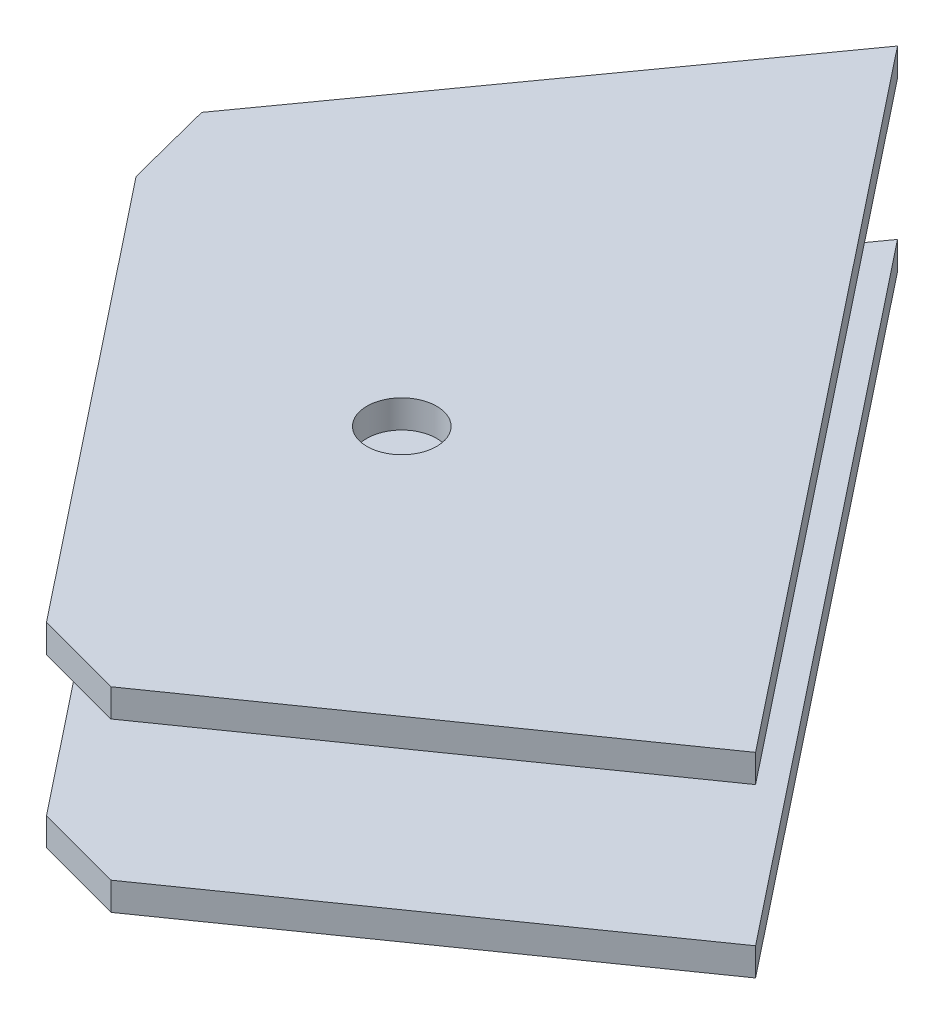
ISO-10303-21;
HEADER;
FILE_DESCRIPTION(('STEP AP214'),'2;1');
FILE_NAME('part.step','',(''),(''),'','','');
FILE_SCHEMA(('AUTOMOTIVE_DESIGN { 1 0 10303 214 1 1 1 1 }'));
ENDSEC;
DATA;
#1=APPLICATION_CONTEXT('core data for automotive mechanical design processes');
#2=APPLICATION_PROTOCOL_DEFINITION('international standard','automotive_design',2000,#1);
#3=PRODUCT_CONTEXT('',#1,'mechanical');
#4=PRODUCT('Part','Part','',(#3));
#5=PRODUCT_RELATED_PRODUCT_CATEGORY('part','',(#4));
#6=PRODUCT_DEFINITION_FORMATION('','',#4);
#7=PRODUCT_DEFINITION_CONTEXT('part definition',#1,'design');
#8=PRODUCT_DEFINITION('design','',#6,#7);
#9=PRODUCT_DEFINITION_SHAPE('','',#8);
#10=(LENGTH_UNIT() NAMED_UNIT(*) SI_UNIT(.MILLI.,.METRE.));
#11=(NAMED_UNIT(*) PLANE_ANGLE_UNIT() SI_UNIT($,.RADIAN.));
#12=(NAMED_UNIT(*) SI_UNIT($,.STERADIAN.) SOLID_ANGLE_UNIT());
#13=UNCERTAINTY_MEASURE_WITH_UNIT(LENGTH_MEASURE(1.E-05),#10,'distance_accuracy_value','');
#14=(GEOMETRIC_REPRESENTATION_CONTEXT(3) GLOBAL_UNCERTAINTY_ASSIGNED_CONTEXT((#13)) GLOBAL_UNIT_ASSIGNED_CONTEXT((#10,
#11,#12)) REPRESENTATION_CONTEXT('',''));
#15=CARTESIAN_POINT('',(0.,0.,0.));
#16=DIRECTION('',(0.,0.,1.));
#17=DIRECTION('',(1.,0.,0.));
#18=AXIS2_PLACEMENT_3D('',#15,#16,#17);
#19=CARTESIAN_POINT('',(7.29288874574905,-8.89,33.75901036086));
#20=DIRECTION('',(-0.258818999626621,0.,0.965925838474303));
#21=DIRECTION('',(0.965925838474303,0.,0.258818999626621));
#22=AXIS2_PLACEMENT_3D('',#19,#20,#21);
#23=PLANE('',#22);
#24=DIRECTION('',(0.965925838474302,0.,0.258818999626621));
#25=VECTOR('',#24,1.);
#26=CARTESIAN_POINT('',(7.29288874574905,-6.35,33.75901036086));
#27=LINE('',#26,#25);
#28=CARTESIAN_POINT('',(-0.713995357916995,-6.35,31.613572635423));
#29=VERTEX_POINT('',#28);
#30=CARTESIAN_POINT('',(7.29288874574905,-6.35,33.75901036086));
#31=VERTEX_POINT('',#30);
#32=EDGE_CURVE('E130',#29,#31,#27,.T.);
#33=ORIENTED_EDGE('',*,*,#32,.F.);
#34=DIRECTION('',(0.,1.,0.));
#35=VECTOR('',#34,1.);
#36=CARTESIAN_POINT('',(-0.713995357916995,-8.89,31.613572635423));
#37=LINE('',#36,#35);
#38=CARTESIAN_POINT('',(-0.713995357916995,-8.89,31.613572635423));
#39=VERTEX_POINT('',#38);
#40=EDGE_CURVE('E12',#39,#29,#37,.T.);
#41=ORIENTED_EDGE('',*,*,#40,.F.);
#42=DIRECTION('',(0.965925838474302,0.,0.258818999626621));
#43=VECTOR('',#42,1.);
#44=CARTESIAN_POINT('',(7.29288874574905,-8.89,33.75901036086));
#45=LINE('',#44,#43);
#46=CARTESIAN_POINT('',(7.29288874574905,-8.89,33.75901036086));
#47=VERTEX_POINT('',#46);
#48=EDGE_CURVE('E145',#39,#47,#45,.T.);
#49=ORIENTED_EDGE('',*,*,#48,.T.);
#50=DIRECTION('',(0.,1.,0.));
#51=VECTOR('',#50,1.);
#52=CARTESIAN_POINT('',(7.29288874574905,-8.89,33.75901036086));
#53=LINE('',#52,#51);
#54=EDGE_CURVE('E94',#47,#31,#53,.T.);
#55=ORIENTED_EDGE('',*,*,#54,.T.);
#56=EDGE_LOOP('',(#33,#41,#49,#55));
#57=FACE_BOUND('',#56,.T.);
#58=ADVANCED_FACE('F44',(#57),#23,.T.);
#59=CARTESIAN_POINT('',(-0.713995357916995,-8.89,31.613572635423));
#60=DIRECTION('',(-0.783884943902112,0.,0.620906107816297));
#61=DIRECTION('',(0.620906107816297,0.,0.783884943902112));
#62=AXIS2_PLACEMENT_3D('',#59,#60,#61);
#63=PLANE('',#62);
#64=DIRECTION('',(0.620906107816297,0.,0.783884943902112));
#65=VECTOR('',#64,1.);
#66=CARTESIAN_POINT('',(-0.713995357916995,-6.35,31.613572635423));
#67=LINE('',#66,#65);
#68=CARTESIAN_POINT('',(-31.777418824543,-6.35,-7.6035483672712));
#69=VERTEX_POINT('',#68);
#70=EDGE_CURVE('E143',#69,#29,#67,.T.);
#71=ORIENTED_EDGE('',*,*,#70,.F.);
#72=DIRECTION('',(0.,1.,0.));
#73=VECTOR('',#72,1.);
#74=CARTESIAN_POINT('',(-31.777418824543,-8.89,-7.6035483672712));
#75=LINE('',#74,#73);
#76=CARTESIAN_POINT('',(-31.777418824543,-8.89,-7.6035483672712));
#77=VERTEX_POINT('',#76);
#78=EDGE_CURVE('E53',#77,#69,#75,.T.);
#79=ORIENTED_EDGE('',*,*,#78,.F.);
#80=DIRECTION('',(0.620906107816297,0.,0.783884943902112));
#81=VECTOR('',#80,1.);
#82=CARTESIAN_POINT('',(-0.713995357916995,-8.89,31.613572635423));
#83=LINE('',#82,#81);
#84=EDGE_CURVE('E120',#77,#39,#83,.T.);
#85=ORIENTED_EDGE('',*,*,#84,.T.);
#86=ORIENTED_EDGE('',*,*,#40,.T.);
#87=EDGE_LOOP('',(#71,#79,#85,#86));
#88=FACE_BOUND('',#87,.T.);
#89=ADVANCED_FACE('F179',(#88),#63,.T.);
#90=CARTESIAN_POINT('',(-33.8367792385884,-8.89,-15.6330023193371));
#91=DIRECTION('',(-0.968648595473999,0.,0.248434897883244));
#92=DIRECTION('',(0.248434897883244,0.,0.968648595473999));
#93=AXIS2_PLACEMENT_3D('',#90,#91,#92);
#94=PLANE('',#93);
#95=DIRECTION('',(0.248434897883244,0.,0.968648595473999));
#96=VECTOR('',#95,1.);
#97=CARTESIAN_POINT('',(-33.8367792385884,-6.35,-15.6330023193371));
#98=LINE('',#97,#96);
#99=CARTESIAN_POINT('',(-33.8367792385884,-6.35,-15.6330023193371));
#100=VERTEX_POINT('',#99);
#101=EDGE_CURVE('E107',#100,#69,#98,.T.);
#102=ORIENTED_EDGE('',*,*,#101,.F.);
#103=DIRECTION('',(0.,1.,0.));
#104=VECTOR('',#103,1.);
#105=CARTESIAN_POINT('',(-33.8367792385884,-8.89,-15.6330023193371));
#106=LINE('',#105,#104);
#107=CARTESIAN_POINT('',(-33.8367792385884,-8.89,-15.6330023193371));
#108=VERTEX_POINT('',#107);
#109=EDGE_CURVE('E102',#108,#100,#106,.T.);
#110=ORIENTED_EDGE('',*,*,#109,.F.);
#111=DIRECTION('',(0.248434897883244,0.,0.968648595473999));
#112=VECTOR('',#111,1.);
#113=CARTESIAN_POINT('',(-33.8367792385884,-8.89,-15.6330023193371));
#114=LINE('',#113,#112);
#115=EDGE_CURVE('E105',#108,#77,#114,.T.);
#116=ORIENTED_EDGE('',*,*,#115,.T.);
#117=ORIENTED_EDGE('',*,*,#78,.T.);
#118=EDGE_LOOP('',(#102,#110,#116,#117));
#119=FACE_BOUND('',#118,.T.);
#120=ADVANCED_FACE('F104',(#119),#94,.T.);
#121=CARTESIAN_POINT('',(-7.41224478573321,-8.89,-52.5218809641673));
#122=DIRECTION('',(-0.812947488311234,0.,-0.582336999724785));
#123=DIRECTION('',(-0.582336999724785,0.,0.812947488311234));
#124=AXIS2_PLACEMENT_3D('',#121,#122,#123);
#125=PLANE('',#124);
#126=DIRECTION('',(-0.582336999724785,0.,0.812947488311234));
#127=VECTOR('',#126,1.);
#128=CARTESIAN_POINT('',(-7.41224478573321,-6.35,-52.5218809641673));
#129=LINE('',#128,#127);
#130=CARTESIAN_POINT('',(-7.41224478573321,-6.35,-52.5218809641673));
#131=VERTEX_POINT('',#130);
#132=EDGE_CURVE('E140',#131,#100,#129,.T.);
#133=ORIENTED_EDGE('',*,*,#132,.F.);
#134=DIRECTION('',(0.,1.,0.));
#135=VECTOR('',#134,1.);
#136=CARTESIAN_POINT('',(-7.41224478573321,-8.89,-52.5218809641673));
#137=LINE('',#136,#135);
#138=CARTESIAN_POINT('',(-7.41224478573321,-8.89,-52.5218809641673));
#139=VERTEX_POINT('',#138);
#140=EDGE_CURVE('E112',#139,#131,#137,.T.);
#141=ORIENTED_EDGE('',*,*,#140,.F.);
#142=DIRECTION('',(-0.582336999724785,0.,0.812947488311234));
#143=VECTOR('',#142,1.);
#144=CARTESIAN_POINT('',(-7.41224478573321,-8.89,-52.5218809641673));
#145=LINE('',#144,#143);
#146=EDGE_CURVE('E118',#139,#108,#145,.T.);
#147=ORIENTED_EDGE('',*,*,#146,.T.);
#148=ORIENTED_EDGE('',*,*,#109,.T.);
#149=EDGE_LOOP('',(#133,#141,#147,#148));
#150=FACE_BOUND('',#149,.T.);
#151=ADVANCED_FACE('F122',(#150),#125,.T.);
#152=CARTESIAN_POINT('',(41.7943980712831,-8.89,9.60079103076962));
#153=DIRECTION('',(0.783884943901653,0.,-0.620906107816878));
#154=DIRECTION('',(-0.620906107816878,0.,-0.783884943901653));
#155=AXIS2_PLACEMENT_3D('',#152,#153,#154);
#156=PLANE('',#155);
#157=DIRECTION('',(-0.620906107816877,0.,-0.783884943901653));
#158=VECTOR('',#157,1.);
#159=CARTESIAN_POINT('',(41.7943980712831,-6.35,9.60079103076962));
#160=LINE('',#159,#158);
#161=CARTESIAN_POINT('',(41.7943980712831,-6.35,9.60079103076962));
#162=VERTEX_POINT('',#161);
#163=EDGE_CURVE('E137',#162,#131,#160,.T.);
#164=ORIENTED_EDGE('',*,*,#163,.F.);
#165=DIRECTION('',(0.,1.,0.));
#166=VECTOR('',#165,1.);
#167=CARTESIAN_POINT('',(41.7943980712831,-8.89,9.60079103076962));
#168=LINE('',#167,#166);
#169=CARTESIAN_POINT('',(41.7943980712831,-8.89,9.60079103076962));
#170=VERTEX_POINT('',#169);
#171=EDGE_CURVE('E149',#170,#162,#168,.T.);
#172=ORIENTED_EDGE('',*,*,#171,.F.);
#173=DIRECTION('',(-0.620906107816877,0.,-0.783884943901653));
#174=VECTOR('',#173,1.);
#175=CARTESIAN_POINT('',(41.7943980712831,-8.89,9.60079103076962));
#176=LINE('',#175,#174);
#177=EDGE_CURVE('E123',#170,#139,#176,.T.);
#178=ORIENTED_EDGE('',*,*,#177,.T.);
#179=ORIENTED_EDGE('',*,*,#140,.T.);
#180=EDGE_LOOP('',(#164,#172,#178,#179));
#181=FACE_BOUND('',#180,.T.);
#182=ADVANCED_FACE('F192',(#181),#156,.T.);
#183=CARTESIAN_POINT('',(7.29288874574905,-8.89,33.75901036086));
#184=DIRECTION('',(0.573576474916939,0.,0.819152017284862));
#185=DIRECTION('',(0.819152017284862,0.,-0.573576474916939));
#186=AXIS2_PLACEMENT_3D('',#183,#184,#185);
#187=PLANE('',#186);
#188=DIRECTION('',(0.819152017284862,0.,-0.573576474916939));
#189=VECTOR('',#188,1.);
#190=CARTESIAN_POINT('',(7.29288874574905,-6.35,33.75901036086));
#191=LINE('',#190,#189);
#192=EDGE_CURVE('E133',#31,#162,#191,.T.);
#193=ORIENTED_EDGE('',*,*,#192,.F.);
#194=ORIENTED_EDGE('',*,*,#54,.F.);
#195=DIRECTION('',(0.819152017284862,0.,-0.573576474916939));
#196=VECTOR('',#195,1.);
#197=CARTESIAN_POINT('',(7.29288874574905,-8.89,33.75901036086));
#198=LINE('',#197,#196);
#199=EDGE_CURVE('E125',#47,#170,#198,.T.);
#200=ORIENTED_EDGE('',*,*,#199,.T.);
#201=ORIENTED_EDGE('',*,*,#171,.T.);
#202=EDGE_LOOP('',(#193,#194,#200,#201));
#203=FACE_BOUND('',#202,.T.);
#204=ADVANCED_FACE('F175',(#203),#187,.T.);
#205=CARTESIAN_POINT('',(-56.8970717772462,-8.89,16.5593655155835));
#206=DIRECTION('',(0.,1.,0.));
#207=DIRECTION('',(0.,0.,1.));
#208=AXIS2_PLACEMENT_3D('',#205,#206,#207);
#209=PLANE('',#208);
#210=CARTESIAN_POINT('',(-7.16806872071792,-8.89,-4.67914789860527));
#211=DIRECTION('',(0.,-1.,0.));
#212=DIRECTION('',(0.,0.,-1.));
#213=AXIS2_PLACEMENT_3D('',#210,#211,#212);
#214=CIRCLE('',#213,1.1303);
#215=CARTESIAN_POINT('',(-7.16806872071792,-8.89,-5.80944789860527));
#216=VERTEX_POINT('',#215);
#217=EDGE_CURVE('E168',#216,#216,#214,.T.);
#218=ORIENTED_EDGE('',*,*,#217,.F.);
#219=EDGE_LOOP('',(#218));
#220=FACE_BOUND('',#219,.T.);
#221=CARTESIAN_POINT('',(-9.82664781130841,-8.89,0.0922157824151844));
#222=DIRECTION('',(0.,-1.,0.));
#223=DIRECTION('',(0.,0.,-1.));
#224=AXIS2_PLACEMENT_3D('',#221,#222,#223);
#225=CIRCLE('',#224,1.1303);
#226=CARTESIAN_POINT('',(-9.82664781130841,-8.89,-1.03808421758482));
#227=VERTEX_POINT('',#226);
#228=EDGE_CURVE('E158',#227,#227,#225,.T.);
#229=ORIENTED_EDGE('',*,*,#228,.F.);
#230=EDGE_LOOP('',(#229));
#231=FACE_BOUND('',#230,.T.);
#232=CARTESIAN_POINT('',(-4.35086165779025,-8.89,7.854263646402));
#233=DIRECTION('',(0.,-1.,0.));
#234=DIRECTION('',(0.,0.,-1.));
#235=AXIS2_PLACEMENT_3D('',#232,#233,#234);
#236=CIRCLE('',#235,1.1303);
#237=CARTESIAN_POINT('',(-4.35086165779025,-8.89,6.723963646402));
#238=VERTEX_POINT('',#237);
#239=EDGE_CURVE('E155',#238,#238,#236,.T.);
#240=ORIENTED_EDGE('',*,*,#239,.F.);
#241=EDGE_LOOP('',(#240));
#242=FACE_BOUND('',#241,.T.);
#243=CARTESIAN_POINT('',(0.,-8.89,0.));
#244=DIRECTION('',(0.,1.,0.));
#245=DIRECTION('',(0.,0.,1.));
#246=AXIS2_PLACEMENT_3D('',#243,#244,#245);
#247=CIRCLE('',#246,3.175);
#248=CARTESIAN_POINT('',(0.,-8.89,3.175));
#249=VERTEX_POINT('',#248);
#250=EDGE_CURVE('E134',#249,#249,#247,.T.);
#251=ORIENTED_EDGE('',*,*,#250,.T.);
#252=EDGE_LOOP('',(#251));
#253=FACE_BOUND('',#252,.T.);
#254=ORIENTED_EDGE('',*,*,#48,.F.);
#255=ORIENTED_EDGE('',*,*,#84,.F.);
#256=ORIENTED_EDGE('',*,*,#115,.F.);
#257=ORIENTED_EDGE('',*,*,#146,.F.);
#258=ORIENTED_EDGE('',*,*,#177,.F.);
#259=ORIENTED_EDGE('',*,*,#199,.F.);
#260=EDGE_LOOP('',(#254,#255,#256,#257,#258,#259));
#261=FACE_BOUND('',#260,.T.);
#262=ADVANCED_FACE('F116',(#220,#231,#242,#253,#261),#209,.F.);
#263=CARTESIAN_POINT('',(-56.8970717772462,-6.35,16.5593655155835));
#264=DIRECTION('',(0.,1.,0.));
#265=DIRECTION('',(0.,0.,1.));
#266=AXIS2_PLACEMENT_3D('',#263,#264,#265);
#267=PLANE('',#266);
#268=CARTESIAN_POINT('',(-7.16806872071792,-6.35,-4.67914789860527));
#269=DIRECTION('',(0.,1.,0.));
#270=DIRECTION('',(0.,0.,1.));
#271=AXIS2_PLACEMENT_3D('',#268,#269,#270);
#272=CIRCLE('',#271,1.1303);
#273=CARTESIAN_POINT('',(-7.16806872071792,-6.35,-3.54884789860527));
#274=VERTEX_POINT('',#273);
#275=EDGE_CURVE('E47',#274,#274,#272,.T.);
#276=ORIENTED_EDGE('',*,*,#275,.F.);
#277=EDGE_LOOP('',(#276));
#278=FACE_BOUND('',#277,.T.);
#279=CARTESIAN_POINT('',(-9.82664781130841,-6.35,0.0922157824151844));
#280=DIRECTION('',(0.,1.,0.));
#281=DIRECTION('',(0.,0.,1.));
#282=AXIS2_PLACEMENT_3D('',#279,#280,#281);
#283=CIRCLE('',#282,1.1303);
#284=CARTESIAN_POINT('',(-9.82664781130841,-6.35,1.22251578241519));
#285=VERTEX_POINT('',#284);
#286=EDGE_CURVE('E156',#285,#285,#283,.T.);
#287=ORIENTED_EDGE('',*,*,#286,.F.);
#288=EDGE_LOOP('',(#287));
#289=FACE_BOUND('',#288,.T.);
#290=CARTESIAN_POINT('',(-4.35086165779025,-6.35,7.854263646402));
#291=DIRECTION('',(0.,1.,0.));
#292=DIRECTION('',(0.,0.,1.));
#293=AXIS2_PLACEMENT_3D('',#290,#291,#292);
#294=CIRCLE('',#293,1.1303);
#295=CARTESIAN_POINT('',(-4.35086165779025,-6.35,8.984563646402));
#296=VERTEX_POINT('',#295);
#297=EDGE_CURVE('E152',#296,#296,#294,.T.);
#298=ORIENTED_EDGE('',*,*,#297,.F.);
#299=EDGE_LOOP('',(#298));
#300=FACE_BOUND('',#299,.T.);
#301=CARTESIAN_POINT('',(0.,-6.35,0.));
#302=DIRECTION('',(0.,1.,0.));
#303=DIRECTION('',(0.,0.,1.));
#304=AXIS2_PLACEMENT_3D('',#301,#302,#303);
#305=CIRCLE('',#304,3.175);
#306=CARTESIAN_POINT('',(0.,-6.35,3.175));
#307=VERTEX_POINT('',#306);
#308=EDGE_CURVE('E154',#307,#307,#305,.T.);
#309=ORIENTED_EDGE('',*,*,#308,.F.);
#310=EDGE_LOOP('',(#309));
#311=FACE_BOUND('',#310,.T.);
#312=ORIENTED_EDGE('',*,*,#32,.T.);
#313=ORIENTED_EDGE('',*,*,#192,.T.);
#314=ORIENTED_EDGE('',*,*,#163,.T.);
#315=ORIENTED_EDGE('',*,*,#132,.T.);
#316=ORIENTED_EDGE('',*,*,#101,.T.);
#317=ORIENTED_EDGE('',*,*,#70,.T.);
#318=EDGE_LOOP('',(#312,#313,#314,#315,#316,#317));
#319=FACE_BOUND('',#318,.T.);
#320=ADVANCED_FACE('F178',(#278,#289,#300,#311,#319),#267,.T.);
#321=CARTESIAN_POINT('',(0.,-8.89,0.));
#322=DIRECTION('',(0.,1.,0.));
#323=DIRECTION('',(0.,0.,1.));
#324=AXIS2_PLACEMENT_3D('',#321,#322,#323);
#325=CYLINDRICAL_SURFACE('',#324,3.175);
#326=ORIENTED_EDGE('',*,*,#250,.F.);
#327=EDGE_LOOP('',(#326));
#328=FACE_BOUND('',#327,.T.);
#329=ORIENTED_EDGE('',*,*,#308,.T.);
#330=EDGE_LOOP('',(#329));
#331=FACE_BOUND('',#330,.T.);
#332=ADVANCED_FACE('F203',(#328,#331),#325,.F.);
#333=CARTESIAN_POINT('',(-4.35086165779025,-3.81,7.854263646402));
#334=DIRECTION('',(0.,-1.,0.));
#335=DIRECTION('',(0.,0.,-1.));
#336=AXIS2_PLACEMENT_3D('',#333,#334,#335);
#337=CYLINDRICAL_SURFACE('',#336,1.1303);
#338=ORIENTED_EDGE('',*,*,#297,.T.);
#339=EDGE_LOOP('',(#338));
#340=FACE_BOUND('',#339,.T.);
#341=ORIENTED_EDGE('',*,*,#239,.T.);
#342=EDGE_LOOP('',(#341));
#343=FACE_BOUND('',#342,.T.);
#344=ADVANCED_FACE('F210',(#340,#343),#337,.F.);
#345=CARTESIAN_POINT('',(-9.82664781130841,-3.81,0.0922157824151844));
#346=DIRECTION('',(0.,-1.,0.));
#347=DIRECTION('',(0.,0.,-1.));
#348=AXIS2_PLACEMENT_3D('',#345,#346,#347);
#349=CYLINDRICAL_SURFACE('',#348,1.1303);
#350=ORIENTED_EDGE('',*,*,#286,.T.);
#351=EDGE_LOOP('',(#350));
#352=FACE_BOUND('',#351,.T.);
#353=ORIENTED_EDGE('',*,*,#228,.T.);
#354=EDGE_LOOP('',(#353));
#355=FACE_BOUND('',#354,.T.);
#356=ADVANCED_FACE('F214',(#352,#355),#349,.F.);
#357=CARTESIAN_POINT('',(-7.16806872071792,-3.81,-4.67914789860527));
#358=DIRECTION('',(0.,-1.,0.));
#359=DIRECTION('',(0.,0.,-1.));
#360=AXIS2_PLACEMENT_3D('',#357,#358,#359);
#361=CYLINDRICAL_SURFACE('',#360,1.1303);
#362=ORIENTED_EDGE('',*,*,#275,.T.);
#363=EDGE_LOOP('',(#362));
#364=FACE_BOUND('',#363,.T.);
#365=ORIENTED_EDGE('',*,*,#217,.T.);
#366=EDGE_LOOP('',(#365));
#367=FACE_BOUND('',#366,.T.);
#368=ADVANCED_FACE('F218',(#364,#367),#361,.F.);
#369=CLOSED_SHELL('',(#58,#89,#120,#151,#182,#204,#262,#320,#332,#344,#356,#368));
#370=MANIFOLD_SOLID_BREP('B2',#369);
#371=CARTESIAN_POINT('',(41.7943980712831,8.89,9.60079103076962));
#372=DIRECTION('',(0.,1.,0.));
#373=DIRECTION('',(0.,0.,1.));
#374=AXIS2_PLACEMENT_3D('',#371,#372,#373);
#375=PLANE('',#374);
#376=DIRECTION('',(0.819152017284862,0.,-0.573576474916939));
#377=VECTOR('',#376,1.);
#378=CARTESIAN_POINT('',(7.29288874574905,8.89,33.75901036086));
#379=LINE('',#378,#377);
#380=CARTESIAN_POINT('',(7.29288874574905,8.89,33.75901036086));
#381=VERTEX_POINT('',#380);
#382=CARTESIAN_POINT('',(41.7943980712831,8.89,9.60079103076962));
#383=VERTEX_POINT('',#382);
#384=EDGE_CURVE('E375',#381,#383,#379,.T.);
#385=ORIENTED_EDGE('',*,*,#384,.T.);
#386=DIRECTION('',(-0.620906107816877,0.,-0.783884943901653));
#387=VECTOR('',#386,1.);
#388=CARTESIAN_POINT('',(41.7943980712831,8.89,9.60079103076962));
#389=LINE('',#388,#387);
#390=CARTESIAN_POINT('',(-7.41224478573321,8.89,-52.5218809641673));
#391=VERTEX_POINT('',#390);
#392=EDGE_CURVE('E333',#383,#391,#389,.T.);
#393=ORIENTED_EDGE('',*,*,#392,.T.);
#394=DIRECTION('',(-0.582336999724785,0.,0.812947488311234));
#395=VECTOR('',#394,1.);
#396=CARTESIAN_POINT('',(-7.41224478573321,8.89,-52.5218809641673));
#397=LINE('',#396,#395);
#398=CARTESIAN_POINT('',(-33.8367792385884,8.89,-15.6330023193371));
#399=VERTEX_POINT('',#398);
#400=EDGE_CURVE('E346',#391,#399,#397,.T.);
#401=ORIENTED_EDGE('',*,*,#400,.T.);
#402=DIRECTION('',(0.248434897883244,0.,0.968648595473999));
#403=VECTOR('',#402,1.);
#404=CARTESIAN_POINT('',(-33.8367792385884,8.89,-15.6330023193371));
#405=LINE('',#404,#403);
#406=CARTESIAN_POINT('',(-31.777418824543,8.89,-7.6035483672712));
#407=VERTEX_POINT('',#406);
#408=EDGE_CURVE('E340',#399,#407,#405,.T.);
#409=ORIENTED_EDGE('',*,*,#408,.T.);
#410=DIRECTION('',(0.620906107816297,0.,0.783884943902112));
#411=VECTOR('',#410,1.);
#412=CARTESIAN_POINT('',(-0.713995357916995,8.89,31.613572635423));
#413=LINE('',#412,#411);
#414=CARTESIAN_POINT('',(-0.713995357916995,8.89,31.613572635423));
#415=VERTEX_POINT('',#414);
#416=EDGE_CURVE('E344',#407,#415,#413,.T.);
#417=ORIENTED_EDGE('',*,*,#416,.T.);
#418=DIRECTION('',(0.965925838474302,0.,0.258818999626621));
#419=VECTOR('',#418,1.);
#420=CARTESIAN_POINT('',(7.29288874574905,8.89,33.75901036086));
#421=LINE('',#420,#419);
#422=EDGE_CURVE('E296',#415,#381,#421,.T.);
#423=ORIENTED_EDGE('',*,*,#422,.T.);
#424=EDGE_LOOP('',(#385,#393,#401,#409,#417,#423));
#425=FACE_BOUND('',#424,.T.);
#426=CARTESIAN_POINT('',(0.,8.89,0.));
#427=DIRECTION('',(0.,1.,0.));
#428=DIRECTION('',(0.,0.,1.));
#429=AXIS2_PLACEMENT_3D('',#426,#427,#428);
#430=CIRCLE('',#429,3.175);
#431=CARTESIAN_POINT('',(0.,8.89,3.175));
#432=VERTEX_POINT('',#431);
#433=EDGE_CURVE('E368',#432,#432,#430,.T.);
#434=ORIENTED_EDGE('',*,*,#433,.F.);
#435=EDGE_LOOP('',(#434));
#436=FACE_BOUND('',#435,.T.);
#437=ADVANCED_FACE('F279',(#425,#436),#375,.T.);
#438=CARTESIAN_POINT('',(41.7943980712831,6.35,9.60079103076962));
#439=DIRECTION('',(0.,1.,0.));
#440=DIRECTION('',(0.,0.,1.));
#441=AXIS2_PLACEMENT_3D('',#438,#439,#440);
#442=PLANE('',#441);
#443=DIRECTION('',(0.819152017284862,0.,-0.573576474916939));
#444=VECTOR('',#443,1.);
#445=CARTESIAN_POINT('',(7.29288874574905,6.35,33.75901036086));
#446=LINE('',#445,#444);
#447=CARTESIAN_POINT('',(7.29288874574905,6.35,33.75901036086));
#448=VERTEX_POINT('',#447);
#449=CARTESIAN_POINT('',(41.7943980712831,6.35,9.60079103076962));
#450=VERTEX_POINT('',#449);
#451=EDGE_CURVE('E364',#448,#450,#446,.T.);
#452=ORIENTED_EDGE('',*,*,#451,.F.);
#453=DIRECTION('',(0.965925838474302,0.,0.258818999626621));
#454=VECTOR('',#453,1.);
#455=CARTESIAN_POINT('',(7.29288874574905,6.35,33.75901036086));
#456=LINE('',#455,#454);
#457=CARTESIAN_POINT('',(-0.713995357916995,6.35,31.613572635423));
#458=VERTEX_POINT('',#457);
#459=EDGE_CURVE('E325',#458,#448,#456,.T.);
#460=ORIENTED_EDGE('',*,*,#459,.F.);
#461=DIRECTION('',(0.620906107816297,0.,0.783884943902112));
#462=VECTOR('',#461,1.);
#463=CARTESIAN_POINT('',(-0.713995357916995,6.35,31.613572635423));
#464=LINE('',#463,#462);
#465=CARTESIAN_POINT('',(-31.777418824543,6.35,-7.6035483672712));
#466=VERTEX_POINT('',#465);
#467=EDGE_CURVE('E319',#466,#458,#464,.T.);
#468=ORIENTED_EDGE('',*,*,#467,.F.);
#469=DIRECTION('',(0.248434897883244,0.,0.968648595473999));
#470=VECTOR('',#469,1.);
#471=CARTESIAN_POINT('',(-33.8367792385884,6.35,-15.6330023193371));
#472=LINE('',#471,#470);
#473=CARTESIAN_POINT('',(-33.8367792385884,6.35,-15.6330023193371));
#474=VERTEX_POINT('',#473);
#475=EDGE_CURVE('E354',#474,#466,#472,.T.);
#476=ORIENTED_EDGE('',*,*,#475,.F.);
#477=DIRECTION('',(-0.582336999724785,0.,0.812947488311234));
#478=VECTOR('',#477,1.);
#479=CARTESIAN_POINT('',(-7.41224478573321,6.35,-52.5218809641673));
#480=LINE('',#479,#478);
#481=CARTESIAN_POINT('',(-7.41224478573321,6.35,-52.5218809641673));
#482=VERTEX_POINT('',#481);
#483=EDGE_CURVE('E370',#482,#474,#480,.T.);
#484=ORIENTED_EDGE('',*,*,#483,.F.);
#485=DIRECTION('',(-0.620906107816877,0.,-0.783884943901653));
#486=VECTOR('',#485,1.);
#487=CARTESIAN_POINT('',(41.7943980712831,6.35,9.60079103076962));
#488=LINE('',#487,#486);
#489=EDGE_CURVE('E367',#450,#482,#488,.T.);
#490=ORIENTED_EDGE('',*,*,#489,.F.);
#491=EDGE_LOOP('',(#452,#460,#468,#476,#484,#490));
#492=FACE_BOUND('',#491,.T.);
#493=CARTESIAN_POINT('',(0.,6.35,0.));
#494=DIRECTION('',(0.,1.,0.));
#495=DIRECTION('',(0.,0.,1.));
#496=AXIS2_PLACEMENT_3D('',#493,#494,#495);
#497=CIRCLE('',#496,3.175);
#498=CARTESIAN_POINT('',(0.,6.35,3.175));
#499=VERTEX_POINT('',#498);
#500=EDGE_CURVE('E450',#499,#499,#497,.T.);
#501=ORIENTED_EDGE('',*,*,#500,.T.);
#502=EDGE_LOOP('',(#501));
#503=FACE_BOUND('',#502,.T.);
#504=ADVANCED_FACE('F384',(#492,#503),#442,.F.);
#505=CARTESIAN_POINT('',(7.29288874574905,8.89,33.75901036086));
#506=DIRECTION('',(-0.573576474916939,0.,-0.819152017284862));
#507=DIRECTION('',(-0.819152017284862,0.,0.573576474916939));
#508=AXIS2_PLACEMENT_3D('',#505,#506,#507);
#509=PLANE('',#508);
#510=ORIENTED_EDGE('',*,*,#451,.T.);
#511=DIRECTION('',(0.,-1.,0.));
#512=VECTOR('',#511,1.);
#513=CARTESIAN_POINT('',(41.7943980712831,8.89,9.60079103076962));
#514=LINE('',#513,#512);
#515=EDGE_CURVE('E42',#383,#450,#514,.T.);
#516=ORIENTED_EDGE('',*,*,#515,.F.);
#517=ORIENTED_EDGE('',*,*,#384,.F.);
#518=DIRECTION('',(0.,-1.,0.));
#519=VECTOR('',#518,1.);
#520=CARTESIAN_POINT('',(7.29288874574905,8.89,33.75901036086));
#521=LINE('',#520,#519);
#522=EDGE_CURVE('E360',#381,#448,#521,.T.);
#523=ORIENTED_EDGE('',*,*,#522,.T.);
#524=EDGE_LOOP('',(#510,#516,#517,#523));
#525=FACE_BOUND('',#524,.T.);
#526=ADVANCED_FACE('F281',(#525),#509,.F.);
#527=CARTESIAN_POINT('',(41.7943980712831,8.89,9.60079103076962));
#528=DIRECTION('',(-0.783884943901653,0.,0.620906107816878));
#529=DIRECTION('',(0.620906107816878,0.,0.783884943901653));
#530=AXIS2_PLACEMENT_3D('',#527,#528,#529);
#531=PLANE('',#530);
#532=ORIENTED_EDGE('',*,*,#489,.T.);
#533=DIRECTION('',(0.,-1.,0.));
#534=VECTOR('',#533,1.);
#535=CARTESIAN_POINT('',(-7.41224478573321,8.89,-52.5218809641673));
#536=LINE('',#535,#534);
#537=EDGE_CURVE('E288',#391,#482,#536,.T.);
#538=ORIENTED_EDGE('',*,*,#537,.F.);
#539=ORIENTED_EDGE('',*,*,#392,.F.);
#540=ORIENTED_EDGE('',*,*,#515,.T.);
#541=EDGE_LOOP('',(#532,#538,#539,#540));
#542=FACE_BOUND('',#541,.T.);
#543=ADVANCED_FACE('F409',(#542),#531,.F.);
#544=CARTESIAN_POINT('',(-7.41224478573321,8.89,-52.5218809641673));
#545=DIRECTION('',(0.812947488311234,0.,0.582336999724785));
#546=DIRECTION('',(0.582336999724785,0.,-0.812947488311234));
#547=AXIS2_PLACEMENT_3D('',#544,#545,#546);
#548=PLANE('',#547);
#549=ORIENTED_EDGE('',*,*,#483,.T.);
#550=DIRECTION('',(0.,-1.,0.));
#551=VECTOR('',#550,1.);
#552=CARTESIAN_POINT('',(-33.8367792385884,8.89,-15.6330023193371));
#553=LINE('',#552,#551);
#554=EDGE_CURVE('E355',#399,#474,#553,.T.);
#555=ORIENTED_EDGE('',*,*,#554,.F.);
#556=ORIENTED_EDGE('',*,*,#400,.F.);
#557=ORIENTED_EDGE('',*,*,#537,.T.);
#558=EDGE_LOOP('',(#549,#555,#556,#557));
#559=FACE_BOUND('',#558,.T.);
#560=ADVANCED_FACE('F381',(#559),#548,.F.);
#561=CARTESIAN_POINT('',(-33.8367792385884,8.89,-15.6330023193371));
#562=DIRECTION('',(0.968648595473999,0.,-0.248434897883244));
#563=DIRECTION('',(-0.248434897883244,0.,-0.968648595473999));
#564=AXIS2_PLACEMENT_3D('',#561,#562,#563);
#565=PLANE('',#564);
#566=ORIENTED_EDGE('',*,*,#475,.T.);
#567=DIRECTION('',(0.,-1.,0.));
#568=VECTOR('',#567,1.);
#569=CARTESIAN_POINT('',(-31.777418824543,8.89,-7.6035483672712));
#570=LINE('',#569,#568);
#571=EDGE_CURVE('E351',#407,#466,#570,.T.);
#572=ORIENTED_EDGE('',*,*,#571,.F.);
#573=ORIENTED_EDGE('',*,*,#408,.F.);
#574=ORIENTED_EDGE('',*,*,#554,.T.);
#575=EDGE_LOOP('',(#566,#572,#573,#574));
#576=FACE_BOUND('',#575,.T.);
#577=ADVANCED_FACE('F352',(#576),#565,.F.);
#578=CARTESIAN_POINT('',(-0.713995357916995,8.89,31.613572635423));
#579=DIRECTION('',(0.783884943902112,0.,-0.620906107816297));
#580=DIRECTION('',(-0.620906107816297,0.,-0.783884943902112));
#581=AXIS2_PLACEMENT_3D('',#578,#579,#580);
#582=PLANE('',#581);
#583=ORIENTED_EDGE('',*,*,#467,.T.);
#584=DIRECTION('',(0.,-1.,0.));
#585=VECTOR('',#584,1.);
#586=CARTESIAN_POINT('',(-0.713995357916995,8.89,31.613572635423));
#587=LINE('',#586,#585);
#588=EDGE_CURVE('E356',#415,#458,#587,.T.);
#589=ORIENTED_EDGE('',*,*,#588,.F.);
#590=ORIENTED_EDGE('',*,*,#416,.F.);
#591=ORIENTED_EDGE('',*,*,#571,.T.);
#592=EDGE_LOOP('',(#583,#589,#590,#591));
#593=FACE_BOUND('',#592,.T.);
#594=ADVANCED_FACE('F358',(#593),#582,.F.);
#595=CARTESIAN_POINT('',(7.29288874574905,8.89,33.75901036086));
#596=DIRECTION('',(0.258818999626621,0.,-0.965925838474303));
#597=DIRECTION('',(-0.965925838474303,0.,-0.258818999626621));
#598=AXIS2_PLACEMENT_3D('',#595,#596,#597);
#599=PLANE('',#598);
#600=ORIENTED_EDGE('',*,*,#459,.T.);
#601=ORIENTED_EDGE('',*,*,#522,.F.);
#602=ORIENTED_EDGE('',*,*,#422,.F.);
#603=ORIENTED_EDGE('',*,*,#588,.T.);
#604=EDGE_LOOP('',(#600,#601,#602,#603));
#605=FACE_BOUND('',#604,.T.);
#606=ADVANCED_FACE('F389',(#605),#599,.F.);
#607=CARTESIAN_POINT('',(0.,8.89,0.));
#608=DIRECTION('',(0.,-1.,0.));
#609=DIRECTION('',(0.,0.,-1.));
#610=AXIS2_PLACEMENT_3D('',#607,#608,#609);
#611=CYLINDRICAL_SURFACE('',#610,3.175);
#612=ORIENTED_EDGE('',*,*,#433,.T.);
#613=EDGE_LOOP('',(#612));
#614=FACE_BOUND('',#613,.T.);
#615=ORIENTED_EDGE('',*,*,#500,.F.);
#616=EDGE_LOOP('',(#615));
#617=FACE_BOUND('',#616,.T.);
#618=ADVANCED_FACE('F391',(#614,#617),#611,.F.);
#619=CLOSED_SHELL('',(#437,#504,#526,#543,#560,#577,#594,#606,#618));
#620=MANIFOLD_SOLID_BREP('B6',#619);
#621=ADVANCED_BREP_SHAPE_REPRESENTATION('',(#18,#370,#620),#14);
#622=SHAPE_DEFINITION_REPRESENTATION(#9,#621);
ENDSEC;
END-ISO-10303-21;
